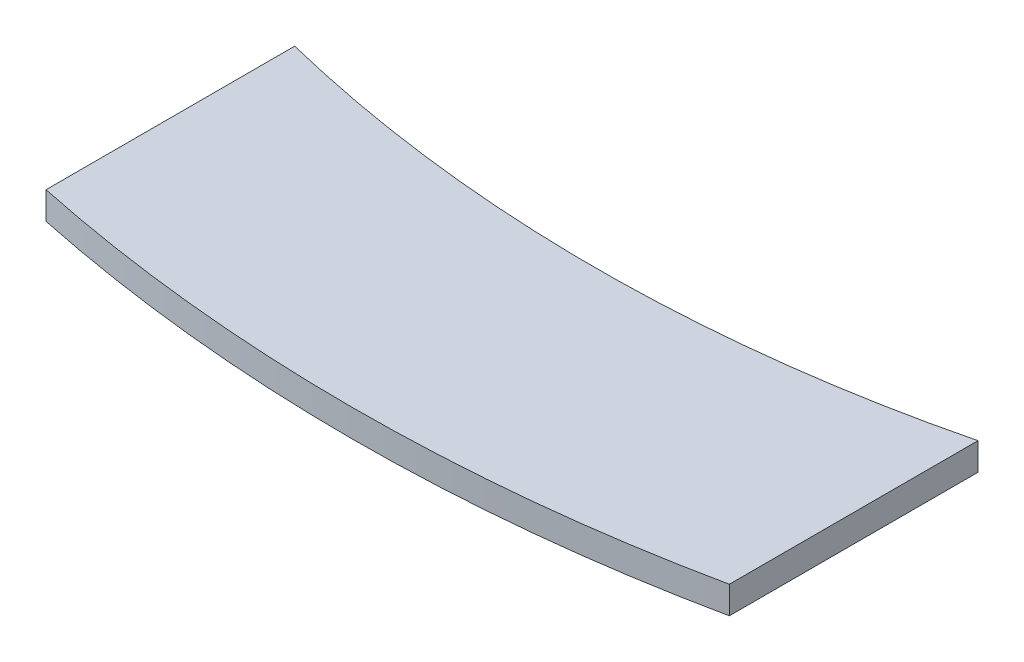
ISO-10303-21;
HEADER;
FILE_DESCRIPTION(('STEP AP214'),'2;1');
FILE_NAME('part.step','',(''),(''),'','','');
FILE_SCHEMA(('AUTOMOTIVE_DESIGN { 1 0 10303 214 1 1 1 1 }'));
ENDSEC;
DATA;
#1=APPLICATION_CONTEXT('core data for automotive mechanical design processes');
#2=APPLICATION_PROTOCOL_DEFINITION('international standard','automotive_design',2000,#1);
#3=PRODUCT_CONTEXT('',#1,'mechanical');
#4=PRODUCT('Part','Part','',(#3));
#5=PRODUCT_RELATED_PRODUCT_CATEGORY('part','',(#4));
#6=PRODUCT_DEFINITION_FORMATION('','',#4);
#7=PRODUCT_DEFINITION_CONTEXT('part definition',#1,'design');
#8=PRODUCT_DEFINITION('design','',#6,#7);
#9=PRODUCT_DEFINITION_SHAPE('','',#8);
#10=(LENGTH_UNIT() NAMED_UNIT(*) SI_UNIT(.MILLI.,.METRE.));
#11=(NAMED_UNIT(*) PLANE_ANGLE_UNIT() SI_UNIT($,.RADIAN.));
#12=(NAMED_UNIT(*) SI_UNIT($,.STERADIAN.) SOLID_ANGLE_UNIT());
#13=UNCERTAINTY_MEASURE_WITH_UNIT(LENGTH_MEASURE(1.E-05),#10,'distance_accuracy_value','');
#14=(GEOMETRIC_REPRESENTATION_CONTEXT(3) GLOBAL_UNCERTAINTY_ASSIGNED_CONTEXT((#13)) GLOBAL_UNIT_ASSIGNED_CONTEXT((#10,
#11,#12)) REPRESENTATION_CONTEXT('',''));
#15=CARTESIAN_POINT('',(0.,0.,0.));
#16=DIRECTION('',(0.,0.,1.));
#17=DIRECTION('',(1.,0.,0.));
#18=AXIS2_PLACEMENT_3D('',#15,#16,#17);
#19=CARTESIAN_POINT('',(0.,1.016,-56.5657401437293));
#20=DIRECTION('',(0.,-1.,0.));
#21=DIRECTION('',(0.,0.,-1.));
#22=AXIS2_PLACEMENT_3D('',#19,#20,#21);
#23=CYLINDRICAL_SURFACE('',#22,52.838);
#24=CARTESIAN_POINT('',(0.,0.,-56.5657401437293));
#25=DIRECTION('',(0.,-1.,0.));
#26=DIRECTION('',(0.,0.,1.));
#27=AXIS2_PLACEMENT_3D('',#24,#25,#26);
#28=CIRCLE('',#27,52.838);
#29=CARTESIAN_POINT('',(12.682,0.,-5.27225985626976));
#30=VERTEX_POINT('',#29);
#31=CARTESIAN_POINT('',(-12.682,0.,-5.27225985626981));
#32=VERTEX_POINT('',#31);
#33=EDGE_CURVE('E96',#30,#32,#28,.T.);
#34=ORIENTED_EDGE('',*,*,#33,.T.);
#35=DIRECTION('',(0.,-1.,0.));
#36=VECTOR('',#35,1.);
#37=CARTESIAN_POINT('',(-12.682,1.016,-5.27225985626981));
#38=LINE('',#37,#36);
#39=CARTESIAN_POINT('',(-12.682,1.016,-5.27225985626981));
#40=VERTEX_POINT('',#39);
#41=EDGE_CURVE('E11',#40,#32,#38,.T.);
#42=ORIENTED_EDGE('',*,*,#41,.F.);
#43=CARTESIAN_POINT('',(0.,1.016,-56.5657401437293));
#44=DIRECTION('',(0.,-1.,0.));
#45=DIRECTION('',(0.,0.,1.));
#46=AXIS2_PLACEMENT_3D('',#43,#44,#45);
#47=CIRCLE('',#46,52.838);
#48=CARTESIAN_POINT('',(12.682,1.016,-5.27225985626976));
#49=VERTEX_POINT('',#48);
#50=EDGE_CURVE('E84',#49,#40,#47,.T.);
#51=ORIENTED_EDGE('',*,*,#50,.F.);
#52=DIRECTION('',(0.,-1.,0.));
#53=VECTOR('',#52,1.);
#54=CARTESIAN_POINT('',(12.682,1.016,-5.27225985626976));
#55=LINE('',#54,#53);
#56=EDGE_CURVE('E92',#49,#30,#55,.T.);
#57=ORIENTED_EDGE('',*,*,#56,.T.);
#58=EDGE_LOOP('',(#34,#42,#51,#57));
#59=FACE_BOUND('',#58,.T.);
#60=ADVANCED_FACE('F33',(#59),#23,.F.);
#61=CARTESIAN_POINT('',(-12.682,1.016,-5.27225985626981));
#62=DIRECTION('',(1.,0.,0.));
#63=DIRECTION('',(0.,0.,-1.));
#64=AXIS2_PLACEMENT_3D('',#61,#62,#63);
#65=PLANE('',#64);
#66=DIRECTION('',(0.,0.,1.));
#67=VECTOR('',#66,1.);
#68=CARTESIAN_POINT('',(-12.682,0.,-5.27225985626981));
#69=LINE('',#68,#67);
#70=CARTESIAN_POINT('',(-12.682,0.,3.9578512896935));
#71=VERTEX_POINT('',#70);
#72=EDGE_CURVE('E88',#32,#71,#69,.T.);
#73=ORIENTED_EDGE('',*,*,#72,.T.);
#74=DIRECTION('',(0.,-1.,0.));
#75=VECTOR('',#74,1.);
#76=CARTESIAN_POINT('',(-12.682,1.016,3.9578512896935));
#77=LINE('',#76,#75);
#78=CARTESIAN_POINT('',(-12.682,1.016,3.9578512896935));
#79=VERTEX_POINT('',#78);
#80=EDGE_CURVE('E41',#79,#71,#77,.T.);
#81=ORIENTED_EDGE('',*,*,#80,.F.);
#82=DIRECTION('',(0.,0.,1.));
#83=VECTOR('',#82,1.);
#84=CARTESIAN_POINT('',(-12.682,1.016,-5.27225985626981));
#85=LINE('',#84,#83);
#86=EDGE_CURVE('E79',#40,#79,#85,.T.);
#87=ORIENTED_EDGE('',*,*,#86,.F.);
#88=ORIENTED_EDGE('',*,*,#41,.T.);
#89=EDGE_LOOP('',(#73,#81,#87,#88));
#90=FACE_BOUND('',#89,.T.);
#91=ADVANCED_FACE('F87',(#90),#65,.F.);
#92=CARTESIAN_POINT('',(0.,1.016,-56.5657401437292));
#93=DIRECTION('',(0.,-1.,0.));
#94=DIRECTION('',(0.,0.,-1.));
#95=AXIS2_PLACEMENT_3D('',#92,#93,#94);
#96=CYLINDRICAL_SURFACE('',#95,61.837999999999);
#97=CARTESIAN_POINT('',(0.,0.,-56.5657401437292));
#98=DIRECTION('',(0.,1.,0.));
#99=DIRECTION('',(0.,0.,1.));
#100=AXIS2_PLACEMENT_3D('',#97,#98,#99);
#101=CIRCLE('',#100,61.837999999999);
#102=CARTESIAN_POINT('',(12.682,0.,3.95785128969351));
#103=VERTEX_POINT('',#102);
#104=EDGE_CURVE('E66',#71,#103,#101,.T.);
#105=ORIENTED_EDGE('',*,*,#104,.T.);
#106=DIRECTION('',(0.,-1.,0.));
#107=VECTOR('',#106,1.);
#108=CARTESIAN_POINT('',(12.682,1.016,3.95785128969351));
#109=LINE('',#108,#107);
#110=CARTESIAN_POINT('',(12.682,1.016,3.95785128969351));
#111=VERTEX_POINT('',#110);
#112=EDGE_CURVE('E89',#111,#103,#109,.T.);
#113=ORIENTED_EDGE('',*,*,#112,.F.);
#114=CARTESIAN_POINT('',(0.,1.016,-56.5657401437292));
#115=DIRECTION('',(0.,1.,0.));
#116=DIRECTION('',(0.,0.,1.));
#117=AXIS2_PLACEMENT_3D('',#114,#115,#116);
#118=CIRCLE('',#117,61.837999999999);
#119=EDGE_CURVE('E82',#79,#111,#118,.T.);
#120=ORIENTED_EDGE('',*,*,#119,.F.);
#121=ORIENTED_EDGE('',*,*,#80,.T.);
#122=EDGE_LOOP('',(#105,#113,#120,#121));
#123=FACE_BOUND('',#122,.T.);
#124=ADVANCED_FACE('F90',(#123),#96,.T.);
#125=CARTESIAN_POINT('',(12.682,1.016,-5.27225985626976));
#126=DIRECTION('',(-1.,0.,0.));
#127=DIRECTION('',(0.,0.,1.));
#128=AXIS2_PLACEMENT_3D('',#125,#126,#127);
#129=PLANE('',#128);
#130=DIRECTION('',(0.,0.,-1.));
#131=VECTOR('',#130,1.);
#132=CARTESIAN_POINT('',(12.682,0.,-5.27225985626976));
#133=LINE('',#132,#131);
#134=EDGE_CURVE('E72',#103,#30,#133,.T.);
#135=ORIENTED_EDGE('',*,*,#134,.T.);
#136=ORIENTED_EDGE('',*,*,#56,.F.);
#137=DIRECTION('',(0.,0.,-1.));
#138=VECTOR('',#137,1.);
#139=CARTESIAN_POINT('',(12.682,1.016,-5.27225985626976));
#140=LINE('',#139,#138);
#141=EDGE_CURVE('E49',#111,#49,#140,.T.);
#142=ORIENTED_EDGE('',*,*,#141,.F.);
#143=ORIENTED_EDGE('',*,*,#112,.T.);
#144=EDGE_LOOP('',(#135,#136,#142,#143));
#145=FACE_BOUND('',#144,.T.);
#146=ADVANCED_FACE('F103',(#145),#129,.F.);
#147=CARTESIAN_POINT('',(0.,1.016,-56.5657401437293));
#148=DIRECTION('',(0.,1.,0.));
#149=DIRECTION('',(0.,0.,1.));
#150=AXIS2_PLACEMENT_3D('',#147,#148,#149);
#151=PLANE('',#150);
#152=ORIENTED_EDGE('',*,*,#50,.T.);
#153=ORIENTED_EDGE('',*,*,#86,.T.);
#154=ORIENTED_EDGE('',*,*,#119,.T.);
#155=ORIENTED_EDGE('',*,*,#141,.T.);
#156=EDGE_LOOP('',(#152,#153,#154,#155));
#157=FACE_BOUND('',#156,.T.);
#158=ADVANCED_FACE('F80',(#157),#151,.T.);
#159=CARTESIAN_POINT('',(0.,0.,-56.5657401437293));
#160=DIRECTION('',(0.,1.,0.));
#161=DIRECTION('',(0.,0.,1.));
#162=AXIS2_PLACEMENT_3D('',#159,#160,#161);
#163=PLANE('',#162);
#164=ORIENTED_EDGE('',*,*,#33,.F.);
#165=ORIENTED_EDGE('',*,*,#134,.F.);
#166=ORIENTED_EDGE('',*,*,#104,.F.);
#167=ORIENTED_EDGE('',*,*,#72,.F.);
#168=EDGE_LOOP('',(#164,#165,#166,#167));
#169=FACE_BOUND('',#168,.T.);
#170=ADVANCED_FACE('F106',(#169),#163,.F.);
#171=CLOSED_SHELL('',(#60,#91,#124,#146,#158,#170));
#172=MANIFOLD_SOLID_BREP('B2',#171);
#173=ADVANCED_BREP_SHAPE_REPRESENTATION('',(#18,#172),#14);
#174=SHAPE_DEFINITION_REPRESENTATION(#9,#173);
ENDSEC;
END-ISO-10303-21;
